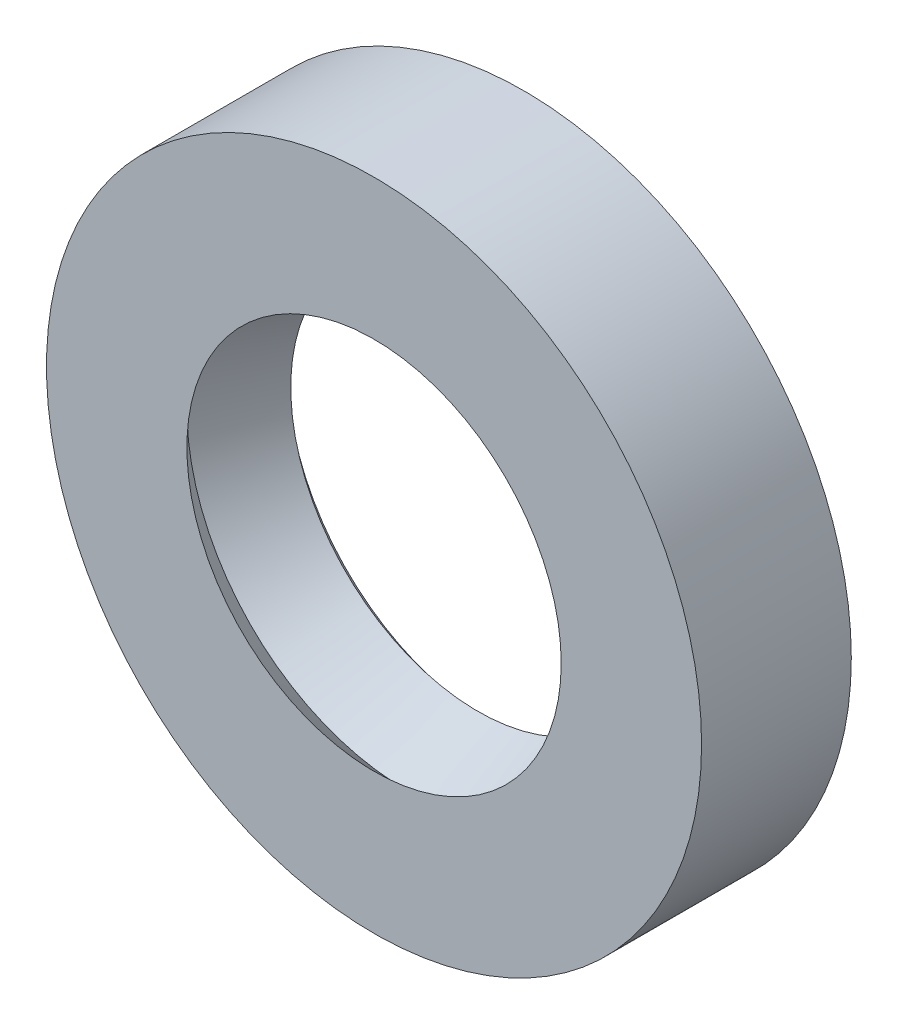
ISO-10303-21;
HEADER;
FILE_DESCRIPTION(('STEP AP214'),'2;1');
FILE_NAME('part.step','',(''),(''),'','','');
FILE_SCHEMA(('AUTOMOTIVE_DESIGN { 1 0 10303 214 1 1 1 1 }'));
ENDSEC;
DATA;
#1=APPLICATION_CONTEXT('core data for automotive mechanical design processes');
#2=APPLICATION_PROTOCOL_DEFINITION('international standard','automotive_design',2000,#1);
#3=PRODUCT_CONTEXT('',#1,'mechanical');
#4=PRODUCT('Part','Part','',(#3));
#5=PRODUCT_RELATED_PRODUCT_CATEGORY('part','',(#4));
#6=PRODUCT_DEFINITION_FORMATION('','',#4);
#7=PRODUCT_DEFINITION_CONTEXT('part definition',#1,'design');
#8=PRODUCT_DEFINITION('design','',#6,#7);
#9=PRODUCT_DEFINITION_SHAPE('','',#8);
#10=(LENGTH_UNIT() NAMED_UNIT(*) SI_UNIT(.MILLI.,.METRE.));
#11=(NAMED_UNIT(*) PLANE_ANGLE_UNIT() SI_UNIT($,.RADIAN.));
#12=(NAMED_UNIT(*) SI_UNIT($,.STERADIAN.) SOLID_ANGLE_UNIT());
#13=UNCERTAINTY_MEASURE_WITH_UNIT(LENGTH_MEASURE(1.E-05),#10,'distance_accuracy_value','');
#14=(GEOMETRIC_REPRESENTATION_CONTEXT(3) GLOBAL_UNCERTAINTY_ASSIGNED_CONTEXT((#13)) GLOBAL_UNIT_ASSIGNED_CONTEXT((#10,
#11,#12)) REPRESENTATION_CONTEXT('',''));
#15=CARTESIAN_POINT('',(0.,0.,0.));
#16=DIRECTION('',(0.,0.,1.));
#17=DIRECTION('',(1.,0.,0.));
#18=AXIS2_PLACEMENT_3D('',#15,#16,#17);
#19=CARTESIAN_POINT('',(0.,0.,3.15));
#20=DIRECTION('',(0.,0.,1.));
#21=DIRECTION('',(1.,0.,0.));
#22=AXIS2_PLACEMENT_3D('',#19,#20,#21);
#23=TOROIDAL_SURFACE('',#22,12.1,0.7);
#24=CARTESIAN_POINT('',(0.,0.,2.45));
#25=DIRECTION('',(0.,0.,1.));
#26=DIRECTION('',(1.,0.,0.));
#27=AXIS2_PLACEMENT_3D('',#24,#25,#26);
#28=CIRCLE('',#27,12.1);
#29=CARTESIAN_POINT('',(12.1,0.,2.45));
#30=VERTEX_POINT('',#29);
#31=EDGE_CURVE('E92',#30,#30,#28,.T.);
#32=ORIENTED_EDGE('',*,*,#31,.T.);
#33=EDGE_LOOP('',(#32));
#34=FACE_BOUND('',#33,.T.);
#35=CARTESIAN_POINT('',(0.,0.,3.85));
#36=DIRECTION('',(0.,0.,1.));
#37=DIRECTION('',(1.,0.,0.));
#38=AXIS2_PLACEMENT_3D('',#35,#36,#37);
#39=CIRCLE('',#38,12.1);
#40=CARTESIAN_POINT('',(12.1,0.,3.85));
#41=VERTEX_POINT('',#40);
#42=EDGE_CURVE('E10',#41,#41,#39,.T.);
#43=ORIENTED_EDGE('',*,*,#42,.F.);
#44=EDGE_LOOP('',(#43));
#45=FACE_BOUND('',#44,.T.);
#46=ADVANCED_FACE('F41',(#34,#45),#23,.T.);
#47=CARTESIAN_POINT('',(0.,0.,6.25));
#48=DIRECTION('',(0.,0.,1.));
#49=DIRECTION('',(1.,0.,0.));
#50=AXIS2_PLACEMENT_3D('',#47,#48,#49);
#51=CONICAL_SURFACE('',#50,12.71,0.248896370801106);
#52=ORIENTED_EDGE('',*,*,#42,.T.);
#53=EDGE_LOOP('',(#52));
#54=FACE_BOUND('',#53,.T.);
#55=CARTESIAN_POINT('',(0.,0.,6.25));
#56=DIRECTION('',(0.,0.,1.));
#57=DIRECTION('',(1.,0.,0.));
#58=AXIS2_PLACEMENT_3D('',#55,#56,#57);
#59=CIRCLE('',#58,12.71);
#60=CARTESIAN_POINT('',(12.71,0.,6.25));
#61=VERTEX_POINT('',#60);
#62=EDGE_CURVE('E48',#61,#61,#59,.T.);
#63=ORIENTED_EDGE('',*,*,#62,.F.);
#64=EDGE_LOOP('',(#63));
#65=FACE_BOUND('',#64,.T.);
#66=ADVANCED_FACE('F117',(#54,#65),#51,.T.);
#67=CARTESIAN_POINT('',(0.,0.,6.25));
#68=DIRECTION('',(0.,0.,-1.));
#69=DIRECTION('',(-1.,0.,0.));
#70=AXIS2_PLACEMENT_3D('',#67,#68,#69);
#71=PLANE('',#70);
#72=ORIENTED_EDGE('',*,*,#62,.T.);
#73=EDGE_LOOP('',(#72));
#74=FACE_BOUND('',#73,.T.);
#75=CARTESIAN_POINT('',(0.,0.,6.25));
#76=DIRECTION('',(0.,0.,1.));
#77=DIRECTION('',(1.,0.,0.));
#78=AXIS2_PLACEMENT_3D('',#75,#76,#77);
#79=CIRCLE('',#78,15.75);
#80=CARTESIAN_POINT('',(15.75,0.,6.25));
#81=VERTEX_POINT('',#80);
#82=EDGE_CURVE('E53',#81,#81,#79,.T.);
#83=ORIENTED_EDGE('',*,*,#82,.F.);
#84=EDGE_LOOP('',(#83));
#85=FACE_BOUND('',#84,.T.);
#86=ADVANCED_FACE('F121',(#74,#85),#71,.T.);
#87=CARTESIAN_POINT('',(0.,0.,20.6630566005821));
#88=DIRECTION('',(0.,0.,1.));
#89=DIRECTION('',(1.,0.,0.));
#90=AXIS2_PLACEMENT_3D('',#87,#88,#89);
#91=CYLINDRICAL_SURFACE('',#90,15.75);
#92=ORIENTED_EDGE('',*,*,#82,.T.);
#93=EDGE_LOOP('',(#92));
#94=FACE_BOUND('',#93,.T.);
#95=CARTESIAN_POINT('',(0.,0.,0.));
#96=DIRECTION('',(0.,0.,1.));
#97=DIRECTION('',(1.,0.,0.));
#98=AXIS2_PLACEMENT_3D('',#95,#96,#97);
#99=CIRCLE('',#98,15.75);
#100=CARTESIAN_POINT('',(15.75,0.,0.));
#101=VERTEX_POINT('',#100);
#102=EDGE_CURVE('E58',#101,#101,#99,.T.);
#103=ORIENTED_EDGE('',*,*,#102,.F.);
#104=EDGE_LOOP('',(#103));
#105=FACE_BOUND('',#104,.T.);
#106=ADVANCED_FACE('F125',(#94,#105),#91,.F.);
#107=CARTESIAN_POINT('',(0.,0.,0.));
#108=DIRECTION('',(0.,0.,-1.));
#109=DIRECTION('',(-1.,0.,0.));
#110=AXIS2_PLACEMENT_3D('',#107,#108,#109);
#111=PLANE('',#110);
#112=ORIENTED_EDGE('',*,*,#102,.T.);
#113=EDGE_LOOP('',(#112));
#114=FACE_BOUND('',#113,.T.);
#115=CARTESIAN_POINT('',(0.,0.,0.));
#116=DIRECTION('',(0.,0.,1.));
#117=DIRECTION('',(1.,0.,0.));
#118=AXIS2_PLACEMENT_3D('',#115,#116,#117);
#119=CIRCLE('',#118,17.5);
#120=CARTESIAN_POINT('',(17.5,0.,0.));
#121=VERTEX_POINT('',#120);
#122=EDGE_CURVE('E64',#121,#121,#119,.T.);
#123=ORIENTED_EDGE('',*,*,#122,.F.);
#124=EDGE_LOOP('',(#123));
#125=FACE_BOUND('',#124,.T.);
#126=ADVANCED_FACE('F131',(#114,#125),#111,.T.);
#127=CARTESIAN_POINT('',(0.,0.,20.6630566005821));
#128=DIRECTION('',(0.,0.,1.));
#129=DIRECTION('',(1.,0.,0.));
#130=AXIS2_PLACEMENT_3D('',#127,#128,#129);
#131=CYLINDRICAL_SURFACE('',#130,17.5);
#132=CARTESIAN_POINT('',(0.,0.,8.));
#133=DIRECTION('',(0.,0.,1.));
#134=DIRECTION('',(1.,0.,0.));
#135=AXIS2_PLACEMENT_3D('',#132,#133,#134);
#136=CIRCLE('',#135,17.5);
#137=CARTESIAN_POINT('',(17.5,0.,8.));
#138=VERTEX_POINT('',#137);
#139=EDGE_CURVE('E68',#138,#138,#136,.T.);
#140=ORIENTED_EDGE('',*,*,#139,.F.);
#141=EDGE_LOOP('',(#140));
#142=FACE_BOUND('',#141,.T.);
#143=ORIENTED_EDGE('',*,*,#122,.T.);
#144=EDGE_LOOP('',(#143));
#145=FACE_BOUND('',#144,.T.);
#146=ADVANCED_FACE('F135',(#142,#145),#131,.T.);
#147=CARTESIAN_POINT('',(0.,0.,8.));
#148=DIRECTION('',(0.,0.,-1.));
#149=DIRECTION('',(-1.,0.,0.));
#150=AXIS2_PLACEMENT_3D('',#147,#148,#149);
#151=PLANE('',#150);
#152=CARTESIAN_POINT('',(0.,0.,8.));
#153=DIRECTION('',(0.,0.,1.));
#154=DIRECTION('',(1.,0.,0.));
#155=AXIS2_PLACEMENT_3D('',#152,#153,#154);
#156=CIRCLE('',#155,9.99999999999999);
#157=CARTESIAN_POINT('',(9.99999999999999,0.,8.));
#158=VERTEX_POINT('',#157);
#159=EDGE_CURVE('E72',#158,#158,#156,.T.);
#160=ORIENTED_EDGE('',*,*,#159,.F.);
#161=EDGE_LOOP('',(#160));
#162=FACE_BOUND('',#161,.T.);
#163=ORIENTED_EDGE('',*,*,#139,.T.);
#164=EDGE_LOOP('',(#163));
#165=FACE_BOUND('',#164,.T.);
#166=ADVANCED_FACE('F139',(#162,#165),#151,.F.);
#167=CARTESIAN_POINT('',(0.,0.,6.25));
#168=DIRECTION('',(0.,0.,-1.));
#169=DIRECTION('',(-1.,0.,0.));
#170=AXIS2_PLACEMENT_3D('',#167,#168,#169);
#171=CONICAL_SURFACE('',#170,11.75,0.78539816339745);
#172=ORIENTED_EDGE('',*,*,#159,.T.);
#173=EDGE_LOOP('',(#172));
#174=FACE_BOUND('',#173,.T.);
#175=CARTESIAN_POINT('',(0.,0.,6.25));
#176=DIRECTION('',(0.,0.,1.));
#177=DIRECTION('',(1.,0.,0.));
#178=AXIS2_PLACEMENT_3D('',#175,#176,#177);
#179=CIRCLE('',#178,11.75);
#180=CARTESIAN_POINT('',(11.75,0.,6.25));
#181=VERTEX_POINT('',#180);
#182=EDGE_CURVE('E76',#181,#181,#179,.T.);
#183=ORIENTED_EDGE('',*,*,#182,.F.);
#184=EDGE_LOOP('',(#183));
#185=FACE_BOUND('',#184,.T.);
#186=ADVANCED_FACE('F143',(#174,#185),#171,.F.);
#187=CARTESIAN_POINT('',(0.,0.,2.45));
#188=DIRECTION('',(0.,0.,1.));
#189=DIRECTION('',(1.,0.,0.));
#190=AXIS2_PLACEMENT_3D('',#187,#188,#189);
#191=CONICAL_SURFACE('',#190,10.,0.431573051223505);
#192=ORIENTED_EDGE('',*,*,#182,.T.);
#193=EDGE_LOOP('',(#192));
#194=FACE_BOUND('',#193,.T.);
#195=CARTESIAN_POINT('',(0.,0.,2.45));
#196=DIRECTION('',(0.,0.,1.));
#197=DIRECTION('',(1.,0.,0.));
#198=AXIS2_PLACEMENT_3D('',#195,#196,#197);
#199=CIRCLE('',#198,10.);
#200=CARTESIAN_POINT('',(10.,0.,2.45));
#201=VERTEX_POINT('',#200);
#202=EDGE_CURVE('E80',#201,#201,#199,.T.);
#203=ORIENTED_EDGE('',*,*,#202,.F.);
#204=EDGE_LOOP('',(#203));
#205=FACE_BOUND('',#204,.T.);
#206=ADVANCED_FACE('F113',(#194,#205),#191,.F.);
#207=CARTESIAN_POINT('',(0.,0.,1.75));
#208=DIRECTION('',(0.,0.,-1.));
#209=DIRECTION('',(-1.,0.,0.));
#210=AXIS2_PLACEMENT_3D('',#207,#208,#209);
#211=CONICAL_SURFACE('',#210,10.875,0.896055384571343);
#212=ORIENTED_EDGE('',*,*,#202,.T.);
#213=EDGE_LOOP('',(#212));
#214=FACE_BOUND('',#213,.T.);
#215=CARTESIAN_POINT('',(0.,0.,1.75));
#216=DIRECTION('',(0.,0.,1.));
#217=DIRECTION('',(1.,0.,0.));
#218=AXIS2_PLACEMENT_3D('',#215,#216,#217);
#219=CIRCLE('',#218,10.875);
#220=CARTESIAN_POINT('',(10.875,0.,1.75));
#221=VERTEX_POINT('',#220);
#222=EDGE_CURVE('E84',#221,#221,#219,.T.);
#223=ORIENTED_EDGE('',*,*,#222,.F.);
#224=EDGE_LOOP('',(#223));
#225=FACE_BOUND('',#224,.T.);
#226=ADVANCED_FACE('F107',(#214,#225),#211,.F.);
#227=CARTESIAN_POINT('',(0.,0.,1.75));
#228=DIRECTION('',(0.,0.,-1.));
#229=DIRECTION('',(-1.,0.,0.));
#230=AXIS2_PLACEMENT_3D('',#227,#228,#229);
#231=PLANE('',#230);
#232=ORIENTED_EDGE('',*,*,#222,.T.);
#233=EDGE_LOOP('',(#232));
#234=FACE_BOUND('',#233,.T.);
#235=CARTESIAN_POINT('',(0.,0.,1.75));
#236=DIRECTION('',(0.,0.,1.));
#237=DIRECTION('',(1.,0.,0.));
#238=AXIS2_PLACEMENT_3D('',#235,#236,#237);
#239=CIRCLE('',#238,12.1);
#240=CARTESIAN_POINT('',(12.1,0.,1.75));
#241=VERTEX_POINT('',#240);
#242=EDGE_CURVE('E88',#241,#241,#239,.T.);
#243=ORIENTED_EDGE('',*,*,#242,.F.);
#244=EDGE_LOOP('',(#243));
#245=FACE_BOUND('',#244,.T.);
#246=ADVANCED_FACE('F102',(#234,#245),#231,.T.);
#247=CARTESIAN_POINT('',(0.,0.,20.6630566005821));
#248=DIRECTION('',(0.,0.,1.));
#249=DIRECTION('',(1.,0.,0.));
#250=AXIS2_PLACEMENT_3D('',#247,#248,#249);
#251=CYLINDRICAL_SURFACE('',#250,12.1);
#252=ORIENTED_EDGE('',*,*,#31,.F.);
#253=EDGE_LOOP('',(#252));
#254=FACE_BOUND('',#253,.T.);
#255=ORIENTED_EDGE('',*,*,#242,.T.);
#256=EDGE_LOOP('',(#255));
#257=FACE_BOUND('',#256,.T.);
#258=ADVANCED_FACE('F99',(#254,#257),#251,.T.);
#259=CLOSED_SHELL('',(#46,#66,#86,#106,#126,#146,#166,#186,#206,#226,#246,#258));
#260=MANIFOLD_SOLID_BREP('B2',#259);
#261=ADVANCED_BREP_SHAPE_REPRESENTATION('',(#18,#260),#14);
#262=SHAPE_DEFINITION_REPRESENTATION(#9,#261);
ENDSEC;
END-ISO-10303-21;
